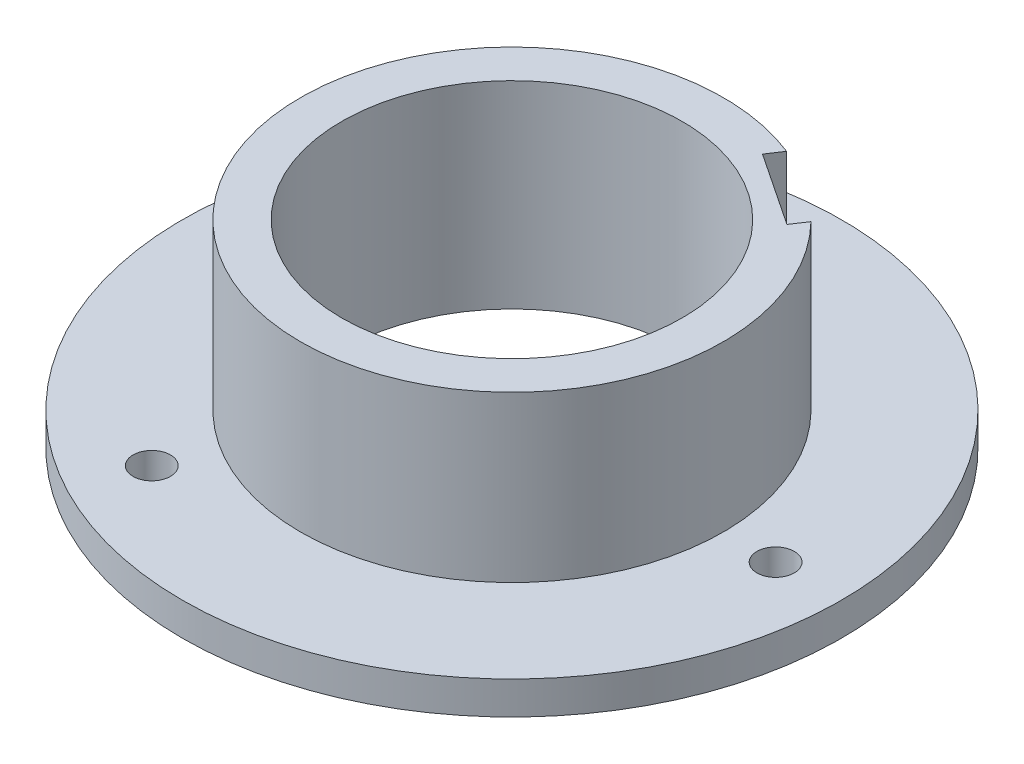
ISO-10303-21;
HEADER;
FILE_DESCRIPTION(('STEP AP214'),'2;1');
FILE_NAME('part.step','',(''),(''),'','','');
FILE_SCHEMA(('AUTOMOTIVE_DESIGN { 1 0 10303 214 1 1 1 1 }'));
ENDSEC;
DATA;
#1=APPLICATION_CONTEXT('core data for automotive mechanical design processes');
#2=APPLICATION_PROTOCOL_DEFINITION('international standard','automotive_design',2000,#1);
#3=PRODUCT_CONTEXT('',#1,'mechanical');
#4=PRODUCT('Part','Part','',(#3));
#5=PRODUCT_RELATED_PRODUCT_CATEGORY('part','',(#4));
#6=PRODUCT_DEFINITION_FORMATION('','',#4);
#7=PRODUCT_DEFINITION_CONTEXT('part definition',#1,'design');
#8=PRODUCT_DEFINITION('design','',#6,#7);
#9=PRODUCT_DEFINITION_SHAPE('','',#8);
#10=(LENGTH_UNIT() NAMED_UNIT(*) SI_UNIT(.MILLI.,.METRE.));
#11=(NAMED_UNIT(*) PLANE_ANGLE_UNIT() SI_UNIT($,.RADIAN.));
#12=(NAMED_UNIT(*) SI_UNIT($,.STERADIAN.) SOLID_ANGLE_UNIT());
#13=UNCERTAINTY_MEASURE_WITH_UNIT(LENGTH_MEASURE(1.E-05),#10,'distance_accuracy_value','');
#14=(GEOMETRIC_REPRESENTATION_CONTEXT(3) GLOBAL_UNCERTAINTY_ASSIGNED_CONTEXT((#13)) GLOBAL_UNIT_ASSIGNED_CONTEXT((#10,
#11,#12)) REPRESENTATION_CONTEXT('',''));
#15=CARTESIAN_POINT('',(0.,0.,0.));
#16=DIRECTION('',(0.,0.,1.));
#17=DIRECTION('',(1.,0.,0.));
#18=AXIS2_PLACEMENT_3D('',#15,#16,#17);
#19=CARTESIAN_POINT('',(0.,18.,0.));
#20=DIRECTION('',(0.,-1.,0.));
#21=DIRECTION('',(0.,0.,-1.));
#22=AXIS2_PLACEMENT_3D('',#19,#20,#21);
#23=CYLINDRICAL_SURFACE('',#22,19.25);
#24=DIRECTION('',(0.,-1.,0.));
#25=VECTOR('',#24,1.);
#26=CARTESIAN_POINT('',(13.7674464791453,18.,-13.4543642526828));
#27=LINE('',#26,#25);
#28=CARTESIAN_POINT('',(13.7674464791453,18.,-13.4543642526828));
#29=VERTEX_POINT('',#28);
#30=CARTESIAN_POINT('',(13.7674464791453,3.,-13.4543642526828));
#31=VERTEX_POINT('',#30);
#32=EDGE_CURVE('E107',#29,#31,#27,.T.);
#33=ORIENTED_EDGE('',*,*,#32,.F.);
#34=CARTESIAN_POINT('',(0.,18.,0.));
#35=DIRECTION('',(0.,1.,0.));
#36=DIRECTION('',(0.,0.,1.));
#37=AXIS2_PLACEMENT_3D('',#34,#35,#36);
#38=CIRCLE('',#37,19.25);
#39=CARTESIAN_POINT('',(7.10917580516555,18.,-17.8891620645364));
#40=VERTEX_POINT('',#39);
#41=EDGE_CURVE('E96',#40,#29,#38,.T.);
#42=ORIENTED_EDGE('',*,*,#41,.F.);
#43=DIRECTION('',(0.,-1.,0.));
#44=VECTOR('',#43,1.);
#45=CARTESIAN_POINT('',(7.10917580516555,18.,-17.8891620645364));
#46=LINE('',#45,#44);
#47=CARTESIAN_POINT('',(7.10917580516555,3.,-17.8891620645364));
#48=VERTEX_POINT('',#47);
#49=EDGE_CURVE('E105',#48,#40,#46,.F.);
#50=ORIENTED_EDGE('',*,*,#49,.F.);
#51=CARTESIAN_POINT('',(0.,3.,0.));
#52=DIRECTION('',(0.,1.,0.));
#53=DIRECTION('',(0.,0.,1.));
#54=AXIS2_PLACEMENT_3D('',#51,#52,#53);
#55=CIRCLE('',#54,19.25);
#56=EDGE_CURVE('E135',#48,#31,#55,.T.);
#57=ORIENTED_EDGE('',*,*,#56,.T.);
#58=EDGE_LOOP('',(#33,#42,#50,#57));
#59=FACE_BOUND('',#58,.T.);
#60=ADVANCED_FACE('F41',(#59),#23,.T.);
#61=CARTESIAN_POINT('',(0.,18.,0.));
#62=DIRECTION('',(0.,1.,0.));
#63=DIRECTION('',(0.,0.,1.));
#64=AXIS2_PLACEMENT_3D('',#61,#62,#63);
#65=PLANE('',#64);
#66=CARTESIAN_POINT('',(0.,18.,0.));
#67=DIRECTION('',(0.,1.,0.));
#68=DIRECTION('',(0.,0.,1.));
#69=AXIS2_PLACEMENT_3D('',#66,#67,#68);
#70=CIRCLE('',#69,15.5);
#71=CARTESIAN_POINT('',(0.,18.,15.5));
#72=VERTEX_POINT('',#71);
#73=EDGE_CURVE('E128',#72,#72,#70,.T.);
#74=ORIENTED_EDGE('',*,*,#73,.F.);
#75=EDGE_LOOP('',(#74));
#76=FACE_BOUND('',#75,.T.);
#77=ORIENTED_EDGE('',*,*,#41,.T.);
#78=DIRECTION('',(0.554349726481699,0.,-0.832283834247467));
#79=VECTOR('',#78,1.);
#80=CARTESIAN_POINT('',(12.8916681187991,18.,-12.139497234842));
#81=LINE('',#80,#79);
#82=CARTESIAN_POINT('',(12.8916681187991,18.,-12.139497234842));
#83=VERTEX_POINT('',#82);
#84=EDGE_CURVE('E64',#83,#29,#81,.T.);
#85=ORIENTED_EDGE('',*,*,#84,.F.);
#86=DIRECTION('',(0.832283834247468,0.,0.554349726481698));
#87=VECTOR('',#86,1.);
#88=CARTESIAN_POINT('',(6.2333974448194,18.,-16.5742950466956));
#89=LINE('',#88,#87);
#90=CARTESIAN_POINT('',(6.2333974448194,18.,-16.5742950466956));
#91=VERTEX_POINT('',#90);
#92=EDGE_CURVE('E83',#91,#83,#89,.T.);
#93=ORIENTED_EDGE('',*,*,#92,.F.);
#94=DIRECTION('',(0.554349726481697,0.,-0.832283834247469));
#95=VECTOR('',#94,1.);
#96=CARTESIAN_POINT('',(-3.32913533698986,18.,-2.21739890592678));
#97=LINE('',#96,#95);
#98=EDGE_CURVE('E11',#91,#40,#97,.T.);
#99=ORIENTED_EDGE('',*,*,#98,.T.);
#100=EDGE_LOOP('',(#77,#85,#93,#99));
#101=FACE_BOUND('',#100,.T.);
#102=ADVANCED_FACE('F94',(#76,#101),#65,.T.);
#103=CARTESIAN_POINT('',(0.,3.,0.));
#104=DIRECTION('',(0.,-1.,0.));
#105=DIRECTION('',(0.,0.,-1.));
#106=AXIS2_PLACEMENT_3D('',#103,#104,#105);
#107=CYLINDRICAL_SURFACE('',#106,30.);
#108=CARTESIAN_POINT('',(0.,3.,0.));
#109=DIRECTION('',(0.,1.,0.));
#110=DIRECTION('',(0.,0.,1.));
#111=AXIS2_PLACEMENT_3D('',#108,#109,#110);
#112=CIRCLE('',#111,30.);
#113=CARTESIAN_POINT('',(0.,3.,30.));
#114=VERTEX_POINT('',#113);
#115=EDGE_CURVE('E49',#114,#114,#112,.T.);
#116=ORIENTED_EDGE('',*,*,#115,.F.);
#117=EDGE_LOOP('',(#116));
#118=FACE_BOUND('',#117,.T.);
#119=CARTESIAN_POINT('',(0.,0.,0.));
#120=DIRECTION('',(0.,1.,0.));
#121=DIRECTION('',(0.,0.,1.));
#122=AXIS2_PLACEMENT_3D('',#119,#120,#121);
#123=CIRCLE('',#122,30.);
#124=CARTESIAN_POINT('',(0.,0.,30.));
#125=VERTEX_POINT('',#124);
#126=EDGE_CURVE('E132',#125,#125,#123,.T.);
#127=ORIENTED_EDGE('',*,*,#126,.T.);
#128=EDGE_LOOP('',(#127));
#129=FACE_BOUND('',#128,.T.);
#130=ADVANCED_FACE('F43',(#118,#129),#107,.T.);
#131=CARTESIAN_POINT('',(0.,3.,0.));
#132=DIRECTION('',(0.,1.,0.));
#133=DIRECTION('',(0.,0.,1.));
#134=AXIS2_PLACEMENT_3D('',#131,#132,#133);
#135=PLANE('',#134);
#136=DIRECTION('',(0.554349726481699,0.,-0.832283834247467));
#137=VECTOR('',#136,1.);
#138=CARTESIAN_POINT('',(12.8916681187991,3.,-12.139497234842));
#139=LINE('',#138,#137);
#140=CARTESIAN_POINT('',(12.8916681187991,3.,-12.139497234842));
#141=VERTEX_POINT('',#140);
#142=EDGE_CURVE('E91',#141,#31,#139,.T.);
#143=ORIENTED_EDGE('',*,*,#142,.T.);
#144=ORIENTED_EDGE('',*,*,#56,.F.);
#145=DIRECTION('',(-0.554349726481697,0.,0.832283834247469));
#146=VECTOR('',#145,1.);
#147=CARTESIAN_POINT('',(7.34209689778279,3.,-18.2388627151906));
#148=LINE('',#147,#146);
#149=CARTESIAN_POINT('',(6.2333974448194,3.,-16.5742950466956));
#150=VERTEX_POINT('',#149);
#151=EDGE_CURVE('E99',#48,#150,#148,.T.);
#152=ORIENTED_EDGE('',*,*,#151,.T.);
#153=DIRECTION('',(0.832283834247468,0.,0.554349726481698));
#154=VECTOR('',#153,1.);
#155=CARTESIAN_POINT('',(6.2333974448194,3.,-16.5742950466956));
#156=LINE('',#155,#154);
#157=EDGE_CURVE('E97',#150,#141,#156,.T.);
#158=ORIENTED_EDGE('',*,*,#157,.T.);
#159=EDGE_LOOP('',(#143,#144,#152,#158));
#160=FACE_BOUND('',#159,.T.);
#161=CARTESIAN_POINT('',(24.,3.,0.));
#162=DIRECTION('',(0.,1.,0.));
#163=DIRECTION('',(0.,0.,1.));
#164=AXIS2_PLACEMENT_3D('',#161,#162,#163);
#165=CIRCLE('',#164,1.7);
#166=CARTESIAN_POINT('',(24.,3.,1.7));
#167=VERTEX_POINT('',#166);
#168=EDGE_CURVE('E114',#167,#167,#165,.T.);
#169=ORIENTED_EDGE('',*,*,#168,.F.);
#170=EDGE_LOOP('',(#169));
#171=FACE_BOUND('',#170,.T.);
#172=CARTESIAN_POINT('',(-12.0000000000001,3.,20.7846096908265));
#173=DIRECTION('',(0.,1.,0.));
#174=DIRECTION('',(0.,0.,1.));
#175=AXIS2_PLACEMENT_3D('',#172,#173,#174);
#176=CIRCLE('',#175,1.7);
#177=CARTESIAN_POINT('',(-12.0000000000001,3.,22.4846096908265));
#178=VERTEX_POINT('',#177);
#179=EDGE_CURVE('E117',#178,#178,#176,.T.);
#180=ORIENTED_EDGE('',*,*,#179,.F.);
#181=EDGE_LOOP('',(#180));
#182=FACE_BOUND('',#181,.T.);
#183=CARTESIAN_POINT('',(-11.9999999999998,3.,-20.7846096908266));
#184=DIRECTION('',(0.,1.,0.));
#185=DIRECTION('',(0.,0.,1.));
#186=AXIS2_PLACEMENT_3D('',#183,#184,#185);
#187=CIRCLE('',#186,1.7);
#188=CARTESIAN_POINT('',(-11.9999999999998,3.,-19.0846096908266));
#189=VERTEX_POINT('',#188);
#190=EDGE_CURVE('E123',#189,#189,#187,.T.);
#191=ORIENTED_EDGE('',*,*,#190,.F.);
#192=EDGE_LOOP('',(#191));
#193=FACE_BOUND('',#192,.T.);
#194=ORIENTED_EDGE('',*,*,#115,.T.);
#195=EDGE_LOOP('',(#194));
#196=FACE_BOUND('',#195,.T.);
#197=ADVANCED_FACE('F147',(#160,#171,#182,#193,#196),#135,.T.);
#198=CARTESIAN_POINT('',(0.,0.,0.));
#199=DIRECTION('',(0.,1.,0.));
#200=DIRECTION('',(0.,0.,1.));
#201=AXIS2_PLACEMENT_3D('',#198,#199,#200);
#202=PLANE('',#201);
#203=CARTESIAN_POINT('',(24.,0.,0.));
#204=DIRECTION('',(0.,1.,0.));
#205=DIRECTION('',(0.,0.,1.));
#206=AXIS2_PLACEMENT_3D('',#203,#204,#205);
#207=CIRCLE('',#206,1.7);
#208=CARTESIAN_POINT('',(24.,0.,1.7));
#209=VERTEX_POINT('',#208);
#210=EDGE_CURVE('E110',#209,#209,#207,.T.);
#211=ORIENTED_EDGE('',*,*,#210,.T.);
#212=EDGE_LOOP('',(#211));
#213=FACE_BOUND('',#212,.T.);
#214=CARTESIAN_POINT('',(-12.0000000000001,0.,20.7846096908265));
#215=DIRECTION('',(0.,1.,0.));
#216=DIRECTION('',(0.,0.,1.));
#217=AXIS2_PLACEMENT_3D('',#214,#215,#216);
#218=CIRCLE('',#217,1.7);
#219=CARTESIAN_POINT('',(-12.0000000000001,0.,22.4846096908265));
#220=VERTEX_POINT('',#219);
#221=EDGE_CURVE('E120',#220,#220,#218,.T.);
#222=ORIENTED_EDGE('',*,*,#221,.T.);
#223=EDGE_LOOP('',(#222));
#224=FACE_BOUND('',#223,.T.);
#225=CARTESIAN_POINT('',(-11.9999999999998,0.,-20.7846096908266));
#226=DIRECTION('',(0.,1.,0.));
#227=DIRECTION('',(0.,0.,1.));
#228=AXIS2_PLACEMENT_3D('',#225,#226,#227);
#229=CIRCLE('',#228,1.7);
#230=CARTESIAN_POINT('',(-11.9999999999998,0.,-19.0846096908266));
#231=VERTEX_POINT('',#230);
#232=EDGE_CURVE('E109',#231,#231,#229,.T.);
#233=ORIENTED_EDGE('',*,*,#232,.T.);
#234=EDGE_LOOP('',(#233));
#235=FACE_BOUND('',#234,.T.);
#236=ORIENTED_EDGE('',*,*,#126,.F.);
#237=EDGE_LOOP('',(#236));
#238=FACE_BOUND('',#237,.T.);
#239=CARTESIAN_POINT('',(0.,0.,0.));
#240=DIRECTION('',(0.,1.,0.));
#241=DIRECTION('',(0.,0.,1.));
#242=AXIS2_PLACEMENT_3D('',#239,#240,#241);
#243=CIRCLE('',#242,15.5);
#244=CARTESIAN_POINT('',(0.,0.,15.5));
#245=VERTEX_POINT('',#244);
#246=EDGE_CURVE('E113',#245,#245,#243,.T.);
#247=ORIENTED_EDGE('',*,*,#246,.T.);
#248=EDGE_LOOP('',(#247));
#249=FACE_BOUND('',#248,.T.);
#250=ADVANCED_FACE('F143',(#213,#224,#235,#238,#249),#202,.F.);
#251=CARTESIAN_POINT('',(0.,18.,0.));
#252=DIRECTION('',(0.,-1.,0.));
#253=DIRECTION('',(0.,0.,-1.));
#254=AXIS2_PLACEMENT_3D('',#251,#252,#253);
#255=CYLINDRICAL_SURFACE('',#254,15.5);
#256=ORIENTED_EDGE('',*,*,#73,.T.);
#257=EDGE_LOOP('',(#256));
#258=FACE_BOUND('',#257,.T.);
#259=ORIENTED_EDGE('',*,*,#246,.F.);
#260=EDGE_LOOP('',(#259));
#261=FACE_BOUND('',#260,.T.);
#262=ADVANCED_FACE('F146',(#258,#261),#255,.F.);
#263=CARTESIAN_POINT('',(-11.9999999999998,0.,-20.7846096908266));
#264=DIRECTION('',(0.,1.,0.));
#265=DIRECTION('',(0.,0.,1.));
#266=AXIS2_PLACEMENT_3D('',#263,#264,#265);
#267=CYLINDRICAL_SURFACE('',#266,1.7);
#268=ORIENTED_EDGE('',*,*,#232,.F.);
#269=EDGE_LOOP('',(#268));
#270=FACE_BOUND('',#269,.T.);
#271=ORIENTED_EDGE('',*,*,#190,.T.);
#272=EDGE_LOOP('',(#271));
#273=FACE_BOUND('',#272,.T.);
#274=ADVANCED_FACE('F152',(#270,#273),#267,.F.);
#275=CARTESIAN_POINT('',(-12.0000000000001,0.,20.7846096908265));
#276=DIRECTION('',(0.,1.,0.));
#277=DIRECTION('',(0.,0.,1.));
#278=AXIS2_PLACEMENT_3D('',#275,#276,#277);
#279=CYLINDRICAL_SURFACE('',#278,1.7);
#280=ORIENTED_EDGE('',*,*,#221,.F.);
#281=EDGE_LOOP('',(#280));
#282=FACE_BOUND('',#281,.T.);
#283=ORIENTED_EDGE('',*,*,#179,.T.);
#284=EDGE_LOOP('',(#283));
#285=FACE_BOUND('',#284,.T.);
#286=ADVANCED_FACE('F159',(#282,#285),#279,.F.);
#287=CARTESIAN_POINT('',(24.,0.,0.));
#288=DIRECTION('',(0.,1.,0.));
#289=DIRECTION('',(0.,0.,1.));
#290=AXIS2_PLACEMENT_3D('',#287,#288,#289);
#291=CYLINDRICAL_SURFACE('',#290,1.7);
#292=ORIENTED_EDGE('',*,*,#210,.F.);
#293=EDGE_LOOP('',(#292));
#294=FACE_BOUND('',#293,.T.);
#295=ORIENTED_EDGE('',*,*,#168,.T.);
#296=EDGE_LOOP('',(#295));
#297=FACE_BOUND('',#296,.T.);
#298=ADVANCED_FACE('F175',(#294,#297),#291,.F.);
#299=CARTESIAN_POINT('',(12.8916681187991,18.,-12.139497234842));
#300=DIRECTION('',(-0.832283834247467,0.,-0.554349726481699));
#301=DIRECTION('',(-0.554349726481699,0.,0.832283834247467));
#302=AXIS2_PLACEMENT_3D('',#299,#300,#301);
#303=PLANE('',#302);
#304=ORIENTED_EDGE('',*,*,#32,.T.);
#305=ORIENTED_EDGE('',*,*,#142,.F.);
#306=DIRECTION('',(0.,-1.,0.));
#307=VECTOR('',#306,1.);
#308=CARTESIAN_POINT('',(12.8916681187991,18.,-12.139497234842));
#309=LINE('',#308,#307);
#310=EDGE_CURVE('E85',#83,#141,#309,.T.);
#311=ORIENTED_EDGE('',*,*,#310,.F.);
#312=ORIENTED_EDGE('',*,*,#84,.T.);
#313=EDGE_LOOP('',(#304,#305,#311,#312));
#314=FACE_BOUND('',#313,.T.);
#315=ADVANCED_FACE('F89',(#314),#303,.T.);
#316=CARTESIAN_POINT('',(7.34209689778279,18.,-18.2388627151906));
#317=DIRECTION('',(0.832283834247469,0.,0.554349726481696));
#318=DIRECTION('',(0.554349726481697,0.,-0.832283834247469));
#319=AXIS2_PLACEMENT_3D('',#316,#317,#318);
#320=PLANE('',#319);
#321=ORIENTED_EDGE('',*,*,#49,.T.);
#322=ORIENTED_EDGE('',*,*,#98,.F.);
#323=DIRECTION('',(0.,-1.,0.));
#324=VECTOR('',#323,1.);
#325=CARTESIAN_POINT('',(6.2333974448194,18.,-16.5742950466956));
#326=LINE('',#325,#324);
#327=EDGE_CURVE('E56',#91,#150,#326,.T.);
#328=ORIENTED_EDGE('',*,*,#327,.T.);
#329=ORIENTED_EDGE('',*,*,#151,.F.);
#330=EDGE_LOOP('',(#321,#322,#328,#329));
#331=FACE_BOUND('',#330,.T.);
#332=ADVANCED_FACE('F181',(#331),#320,.T.);
#333=CARTESIAN_POINT('',(6.2333974448194,18.,-16.5742950466956));
#334=DIRECTION('',(0.554349726481697,0.,-0.832283834247468));
#335=DIRECTION('',(-0.832283834247468,0.,-0.554349726481698));
#336=AXIS2_PLACEMENT_3D('',#333,#334,#335);
#337=PLANE('',#336);
#338=ORIENTED_EDGE('',*,*,#157,.F.);
#339=ORIENTED_EDGE('',*,*,#327,.F.);
#340=ORIENTED_EDGE('',*,*,#92,.T.);
#341=ORIENTED_EDGE('',*,*,#310,.T.);
#342=EDGE_LOOP('',(#338,#339,#340,#341));
#343=FACE_BOUND('',#342,.T.);
#344=ADVANCED_FACE('F84',(#343),#337,.T.);
#345=CLOSED_SHELL('',(#60,#102,#130,#197,#250,#262,#274,#286,#298,#315,#332,#344));
#346=MANIFOLD_SOLID_BREP('B2',#345);
#347=ADVANCED_BREP_SHAPE_REPRESENTATION('',(#18,#346),#14);
#348=SHAPE_DEFINITION_REPRESENTATION(#9,#347);
ENDSEC;
END-ISO-10303-21;
